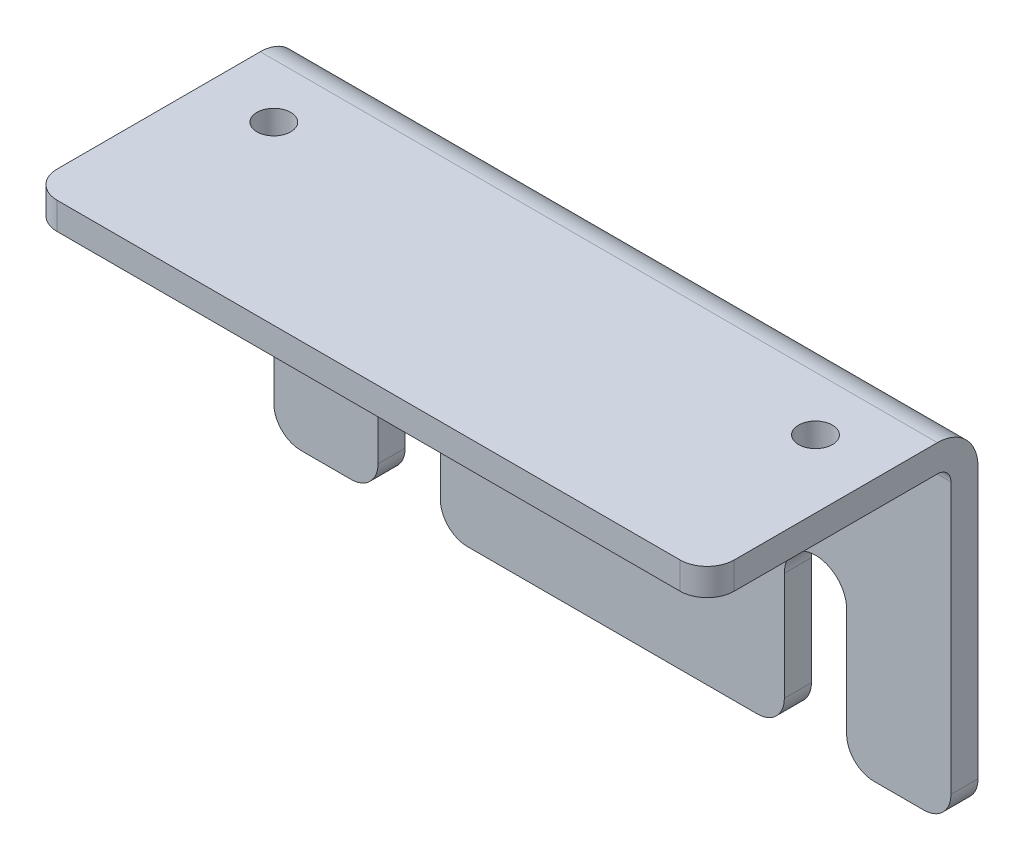
ISO-10303-21;
HEADER;
FILE_DESCRIPTION(('STEP AP214'),'2;1');
FILE_NAME('part.step','',(''),(''),'','','');
FILE_SCHEMA(('AUTOMOTIVE_DESIGN { 1 0 10303 214 1 1 1 1 }'));
ENDSEC;
DATA;
#1=APPLICATION_CONTEXT('core data for automotive mechanical design processes');
#2=APPLICATION_PROTOCOL_DEFINITION('international standard','automotive_design',2000,#1);
#3=PRODUCT_CONTEXT('',#1,'mechanical');
#4=PRODUCT('Part','Part','',(#3));
#5=PRODUCT_RELATED_PRODUCT_CATEGORY('part','',(#4));
#6=PRODUCT_DEFINITION_FORMATION('','',#4);
#7=PRODUCT_DEFINITION_CONTEXT('part definition',#1,'design');
#8=PRODUCT_DEFINITION('design','',#6,#7);
#9=PRODUCT_DEFINITION_SHAPE('','',#8);
#10=(LENGTH_UNIT() NAMED_UNIT(*) SI_UNIT(.MILLI.,.METRE.));
#11=(NAMED_UNIT(*) PLANE_ANGLE_UNIT() SI_UNIT($,.RADIAN.));
#12=(NAMED_UNIT(*) SI_UNIT($,.STERADIAN.) SOLID_ANGLE_UNIT());
#13=UNCERTAINTY_MEASURE_WITH_UNIT(LENGTH_MEASURE(1.E-05),#10,'distance_accuracy_value','');
#14=(GEOMETRIC_REPRESENTATION_CONTEXT(3) GLOBAL_UNCERTAINTY_ASSIGNED_CONTEXT((#13)) GLOBAL_UNIT_ASSIGNED_CONTEXT((#10,
#11,#12)) REPRESENTATION_CONTEXT('',''));
#15=CARTESIAN_POINT('',(0.,0.,0.));
#16=DIRECTION('',(0.,0.,1.));
#17=DIRECTION('',(1.,0.,0.));
#18=AXIS2_PLACEMENT_3D('',#15,#16,#17);
#19=CARTESIAN_POINT('',(-25.,-93.1219674120872,0.));
#20=DIRECTION('',(0.,0.,-1.));
#21=DIRECTION('',(0.,-1.,0.));
#22=AXIS2_PLACEMENT_3D('',#19,#20,#21);
#23=PLANE('',#22);
#24=DIRECTION('',(0.,1.,0.));
#25=VECTOR('',#24,1.);
#26=CARTESIAN_POINT('',(-23.,-93.1219674120872,0.));
#27=LINE('',#26,#25);
#28=CARTESIAN_POINT('',(-23.,10.5,0.));
#29=VERTEX_POINT('',#28);
#30=CARTESIAN_POINT('',(-23.,12.5,0.));
#31=VERTEX_POINT('',#30);
#32=EDGE_CURVE('E219',#29,#31,#27,.T.);
#33=ORIENTED_EDGE('',*,*,#32,.F.);
#34=DIRECTION('',(1.,0.,0.));
#35=VECTOR('',#34,1.);
#36=CARTESIAN_POINT('',(-25.,10.5,0.));
#37=LINE('',#36,#35);
#38=CARTESIAN_POINT('',(23.,10.5,0.));
#39=VERTEX_POINT('',#38);
#40=EDGE_CURVE('E266',#29,#39,#37,.T.);
#41=ORIENTED_EDGE('',*,*,#40,.T.);
#42=DIRECTION('',(0.,1.,0.));
#43=VECTOR('',#42,1.);
#44=CARTESIAN_POINT('',(23.,-93.1219674120872,0.));
#45=LINE('',#44,#43);
#46=CARTESIAN_POINT('',(23.,12.5,0.));
#47=VERTEX_POINT('',#46);
#48=EDGE_CURVE('E251',#39,#47,#45,.T.);
#49=ORIENTED_EDGE('',*,*,#48,.T.);
#50=DIRECTION('',(1.,0.,0.));
#51=VECTOR('',#50,1.);
#52=CARTESIAN_POINT('',(-25.,12.5,0.));
#53=LINE('',#52,#51);
#54=EDGE_CURVE('E254',#31,#47,#53,.T.);
#55=ORIENTED_EDGE('',*,*,#54,.F.);
#56=EDGE_LOOP('',(#33,#41,#49,#55));
#57=FACE_BOUND('',#56,.T.);
#58=ADVANCED_FACE('F38',(#57),#23,.F.);
#59=CARTESIAN_POINT('',(23.,-93.1219674120872,-2.00000000000001));
#60=DIRECTION('',(0.,1.,0.));
#61=DIRECTION('',(0.,0.,-1.));
#62=AXIS2_PLACEMENT_3D('',#59,#60,#61);
#63=CYLINDRICAL_SURFACE('',#62,2.);
#64=ORIENTED_EDGE('',*,*,#48,.F.);
#65=CARTESIAN_POINT('',(23.,10.5,-2.00000000000001));
#66=DIRECTION('',(0.,1.,0.));
#67=DIRECTION('',(0.,0.,1.));
#68=AXIS2_PLACEMENT_3D('',#65,#66,#67);
#69=CIRCLE('',#68,2.);
#70=CARTESIAN_POINT('',(25.,10.5,-2.00000000000001));
#71=VERTEX_POINT('',#70);
#72=EDGE_CURVE('E272',#39,#71,#69,.T.);
#73=ORIENTED_EDGE('',*,*,#72,.T.);
#74=DIRECTION('',(0.,1.,0.));
#75=VECTOR('',#74,1.);
#76=CARTESIAN_POINT('',(25.,-93.1219674120872,-2.00000000000001));
#77=LINE('',#76,#75);
#78=CARTESIAN_POINT('',(25.,12.5,-2.00000000000001));
#79=VERTEX_POINT('',#78);
#80=EDGE_CURVE('E237',#71,#79,#77,.T.);
#81=ORIENTED_EDGE('',*,*,#80,.T.);
#82=CARTESIAN_POINT('',(23.,12.5,-2.00000000000001));
#83=DIRECTION('',(0.,1.,0.));
#84=DIRECTION('',(0.,0.,1.));
#85=AXIS2_PLACEMENT_3D('',#82,#83,#84);
#86=CIRCLE('',#85,2.);
#87=EDGE_CURVE('E249',#47,#79,#86,.T.);
#88=ORIENTED_EDGE('',*,*,#87,.F.);
#89=EDGE_LOOP('',(#64,#73,#81,#88));
#90=FACE_BOUND('',#89,.T.);
#91=ADVANCED_FACE('F271',(#90),#63,.T.);
#92=CARTESIAN_POINT('',(20.,12.5,-13.));
#93=DIRECTION('',(0.,1.,0.));
#94=DIRECTION('',(0.,0.,-1.));
#95=AXIS2_PLACEMENT_3D('',#92,#93,#94);
#96=CYLINDRICAL_SURFACE('',#95,1.25);
#97=CARTESIAN_POINT('',(20.,12.5,-13.));
#98=DIRECTION('',(0.,-1.,0.));
#99=DIRECTION('',(0.,0.,-1.));
#100=AXIS2_PLACEMENT_3D('',#97,#98,#99);
#101=CIRCLE('',#100,1.25);
#102=CARTESIAN_POINT('',(20.,12.5,-14.25));
#103=VERTEX_POINT('',#102);
#104=EDGE_CURVE('E246',#103,#103,#101,.T.);
#105=ORIENTED_EDGE('',*,*,#104,.F.);
#106=EDGE_LOOP('',(#105));
#107=FACE_BOUND('',#106,.T.);
#108=CARTESIAN_POINT('',(20.,10.5,-13.));
#109=DIRECTION('',(0.,-1.,0.));
#110=DIRECTION('',(0.,0.,-1.));
#111=AXIS2_PLACEMENT_3D('',#108,#109,#110);
#112=CIRCLE('',#111,1.25);
#113=CARTESIAN_POINT('',(20.,10.5,-14.25));
#114=VERTEX_POINT('',#113);
#115=EDGE_CURVE('E276',#114,#114,#112,.T.);
#116=ORIENTED_EDGE('',*,*,#115,.T.);
#117=EDGE_LOOP('',(#116));
#118=FACE_BOUND('',#117,.T.);
#119=ADVANCED_FACE('F461',(#107,#118),#96,.F.);
#120=CARTESIAN_POINT('',(-20.,12.5,-13.));
#121=DIRECTION('',(0.,1.,0.));
#122=DIRECTION('',(0.,0.,-1.));
#123=AXIS2_PLACEMENT_3D('',#120,#121,#122);
#124=CYLINDRICAL_SURFACE('',#123,1.25);
#125=CARTESIAN_POINT('',(-20.,12.5,-13.));
#126=DIRECTION('',(0.,-1.,0.));
#127=DIRECTION('',(0.,0.,-1.));
#128=AXIS2_PLACEMENT_3D('',#125,#126,#127);
#129=CIRCLE('',#128,1.25);
#130=CARTESIAN_POINT('',(-20.,12.5,-14.25));
#131=VERTEX_POINT('',#130);
#132=EDGE_CURVE('E243',#131,#131,#129,.T.);
#133=ORIENTED_EDGE('',*,*,#132,.F.);
#134=EDGE_LOOP('',(#133));
#135=FACE_BOUND('',#134,.T.);
#136=CARTESIAN_POINT('',(-20.,10.5,-13.));
#137=DIRECTION('',(0.,-1.,0.));
#138=DIRECTION('',(0.,0.,-1.));
#139=AXIS2_PLACEMENT_3D('',#136,#137,#138);
#140=CIRCLE('',#139,1.25);
#141=CARTESIAN_POINT('',(-20.,10.5,-14.25));
#142=VERTEX_POINT('',#141);
#143=EDGE_CURVE('E274',#142,#142,#140,.T.);
#144=ORIENTED_EDGE('',*,*,#143,.T.);
#145=EDGE_LOOP('',(#144));
#146=FACE_BOUND('',#145,.T.);
#147=ADVANCED_FACE('F468',(#135,#146),#124,.F.);
#148=CARTESIAN_POINT('',(-23.,-93.1219674120872,-2.00000000000001));
#149=DIRECTION('',(0.,1.,0.));
#150=DIRECTION('',(0.,0.,-1.));
#151=AXIS2_PLACEMENT_3D('',#148,#149,#150);
#152=CYLINDRICAL_SURFACE('',#151,2.);
#153=DIRECTION('',(0.,1.,0.));
#154=VECTOR('',#153,1.);
#155=CARTESIAN_POINT('',(-25.,-93.1219674120872,-2.00000000000001));
#156=LINE('',#155,#154);
#157=CARTESIAN_POINT('',(-25.,10.5,-2.00000000000001));
#158=VERTEX_POINT('',#157);
#159=CARTESIAN_POINT('',(-25.,12.5,-2.00000000000001));
#160=VERTEX_POINT('',#159);
#161=EDGE_CURVE('E234',#158,#160,#156,.T.);
#162=ORIENTED_EDGE('',*,*,#161,.F.);
#163=CARTESIAN_POINT('',(-23.,10.5,-2.00000000000001));
#164=DIRECTION('',(0.,-1.,0.));
#165=DIRECTION('',(0.,0.,-1.));
#166=AXIS2_PLACEMENT_3D('',#163,#164,#165);
#167=CIRCLE('',#166,2.);
#168=EDGE_CURVE('E261',#158,#29,#167,.F.);
#169=ORIENTED_EDGE('',*,*,#168,.T.);
#170=ORIENTED_EDGE('',*,*,#32,.T.);
#171=CARTESIAN_POINT('',(-23.,12.5,-2.00000000000001));
#172=DIRECTION('',(0.,-1.,0.));
#173=DIRECTION('',(0.,0.,-1.));
#174=AXIS2_PLACEMENT_3D('',#171,#172,#173);
#175=CIRCLE('',#174,2.);
#176=EDGE_CURVE('E235',#160,#31,#175,.F.);
#177=ORIENTED_EDGE('',*,*,#176,.F.);
#178=EDGE_LOOP('',(#162,#169,#170,#177));
#179=FACE_BOUND('',#178,.T.);
#180=ADVANCED_FACE('F259',(#179),#152,.T.);
#181=CARTESIAN_POINT('',(-25.,-93.1219674120872,-20.));
#182=DIRECTION('',(1.,0.,0.));
#183=DIRECTION('',(0.,-1.,0.));
#184=AXIS2_PLACEMENT_3D('',#181,#182,#183);
#185=PLANE('',#184);
#186=DIRECTION('',(0.,0.,1.));
#187=VECTOR('',#186,1.);
#188=CARTESIAN_POINT('',(-25.,10.5,-20.));
#189=LINE('',#188,#187);
#190=CARTESIAN_POINT('',(-25.,10.5,-17.));
#191=VERTEX_POINT('',#190);
#192=EDGE_CURVE('E281',#191,#158,#189,.T.);
#193=ORIENTED_EDGE('',*,*,#192,.T.);
#194=ORIENTED_EDGE('',*,*,#161,.T.);
#195=DIRECTION('',(0.,0.,1.));
#196=VECTOR('',#195,1.);
#197=CARTESIAN_POINT('',(-25.,12.5,-20.));
#198=LINE('',#197,#196);
#199=CARTESIAN_POINT('',(-25.,12.5,-17.));
#200=VERTEX_POINT('',#199);
#201=EDGE_CURVE('E213',#160,#200,#198,.F.);
#202=ORIENTED_EDGE('',*,*,#201,.T.);
#203=CARTESIAN_POINT('',(-25.,9.5,-17.));
#204=DIRECTION('',(-1.,0.,0.));
#205=DIRECTION('',(0.,0.,1.));
#206=AXIS2_PLACEMENT_3D('',#203,#204,#205);
#207=CIRCLE('',#206,2.99999999999998);
#208=CARTESIAN_POINT('',(-25.,9.5,-20.));
#209=VERTEX_POINT('',#208);
#210=EDGE_CURVE('E222',#200,#209,#207,.T.);
#211=ORIENTED_EDGE('',*,*,#210,.T.);
#212=DIRECTION('',(0.,1.,0.));
#213=VECTOR('',#212,1.);
#214=CARTESIAN_POINT('',(-25.,0.,-20.));
#215=LINE('',#214,#213);
#216=CARTESIAN_POINT('',(-25.,-10.5,-20.));
#217=VERTEX_POINT('',#216);
#218=EDGE_CURVE('E416',#217,#209,#215,.T.);
#219=ORIENTED_EDGE('',*,*,#218,.F.);
#220=DIRECTION('',(0.,0.,-1.));
#221=VECTOR('',#220,1.);
#222=CARTESIAN_POINT('',(-25.,-10.5,89.2520022699813));
#223=LINE('',#222,#221);
#224=CARTESIAN_POINT('',(-25.,-10.5,-18.));
#225=VERTEX_POINT('',#224);
#226=EDGE_CURVE('E329',#225,#217,#223,.T.);
#227=ORIENTED_EDGE('',*,*,#226,.F.);
#228=DIRECTION('',(0.,1.,0.));
#229=VECTOR('',#228,1.);
#230=CARTESIAN_POINT('',(-25.,-12.5,-18.));
#231=LINE('',#230,#229);
#232=CARTESIAN_POINT('',(-25.,9.5,-18.));
#233=VERTEX_POINT('',#232);
#234=EDGE_CURVE('E381',#225,#233,#231,.T.);
#235=ORIENTED_EDGE('',*,*,#234,.T.);
#236=CARTESIAN_POINT('',(-25.,9.5,-17.));
#237=DIRECTION('',(-1.,0.,0.));
#238=DIRECTION('',(0.,0.,1.));
#239=AXIS2_PLACEMENT_3D('',#236,#237,#238);
#240=CIRCLE('',#239,1.);
#241=EDGE_CURVE('E430',#191,#233,#240,.T.);
#242=ORIENTED_EDGE('',*,*,#241,.F.);
#243=EDGE_LOOP('',(#193,#194,#202,#211,#219,#227,#235,#242));
#244=FACE_BOUND('',#243,.T.);
#245=ADVANCED_FACE('F232',(#244),#185,.F.);
#246=CARTESIAN_POINT('',(-25.,12.5,-20.));
#247=DIRECTION('',(0.,-1.,0.));
#248=DIRECTION('',(0.,0.,1.));
#249=AXIS2_PLACEMENT_3D('',#246,#247,#248);
#250=PLANE('',#249);
#251=ORIENTED_EDGE('',*,*,#132,.T.);
#252=EDGE_LOOP('',(#251));
#253=FACE_BOUND('',#252,.T.);
#254=ORIENTED_EDGE('',*,*,#104,.T.);
#255=EDGE_LOOP('',(#254));
#256=FACE_BOUND('',#255,.T.);
#257=ORIENTED_EDGE('',*,*,#201,.F.);
#258=ORIENTED_EDGE('',*,*,#176,.T.);
#259=ORIENTED_EDGE('',*,*,#54,.T.);
#260=ORIENTED_EDGE('',*,*,#87,.T.);
#261=DIRECTION('',(0.,0.,-1.));
#262=VECTOR('',#261,1.);
#263=CARTESIAN_POINT('',(25.,12.5,-20.));
#264=LINE('',#263,#262);
#265=CARTESIAN_POINT('',(25.,12.5,-17.));
#266=VERTEX_POINT('',#265);
#267=EDGE_CURVE('E216',#266,#79,#264,.F.);
#268=ORIENTED_EDGE('',*,*,#267,.F.);
#269=DIRECTION('',(-1.,0.,0.));
#270=VECTOR('',#269,1.);
#271=CARTESIAN_POINT('',(0.,12.5,-17.));
#272=LINE('',#271,#270);
#273=EDGE_CURVE('E42',#266,#200,#272,.T.);
#274=ORIENTED_EDGE('',*,*,#273,.T.);
#275=EDGE_LOOP('',(#257,#258,#259,#260,#268,#274));
#276=FACE_BOUND('',#275,.T.);
#277=ADVANCED_FACE('F211',(#253,#256,#276),#250,.F.);
#278=CARTESIAN_POINT('',(25.,-93.1219674120872,-20.));
#279=DIRECTION('',(-1.,0.,0.));
#280=DIRECTION('',(0.,1.,0.));
#281=AXIS2_PLACEMENT_3D('',#278,#279,#280);
#282=PLANE('',#281);
#283=ORIENTED_EDGE('',*,*,#80,.F.);
#284=DIRECTION('',(0.,0.,-1.));
#285=VECTOR('',#284,1.);
#286=CARTESIAN_POINT('',(25.,10.5,-20.));
#287=LINE('',#286,#285);
#288=CARTESIAN_POINT('',(25.,10.5,-17.));
#289=VERTEX_POINT('',#288);
#290=EDGE_CURVE('E48',#71,#289,#287,.T.);
#291=ORIENTED_EDGE('',*,*,#290,.T.);
#292=CARTESIAN_POINT('',(25.,9.5,-17.));
#293=DIRECTION('',(-1.,0.,0.));
#294=DIRECTION('',(0.,0.,1.));
#295=AXIS2_PLACEMENT_3D('',#292,#293,#294);
#296=CIRCLE('',#295,1.);
#297=CARTESIAN_POINT('',(25.,9.5,-18.));
#298=VERTEX_POINT('',#297);
#299=EDGE_CURVE('E229',#298,#289,#296,.F.);
#300=ORIENTED_EDGE('',*,*,#299,.F.);
#301=DIRECTION('',(0.,1.,0.));
#302=VECTOR('',#301,1.);
#303=CARTESIAN_POINT('',(25.,-12.5,-18.));
#304=LINE('',#303,#302);
#305=CARTESIAN_POINT('',(25.,-10.5,-18.));
#306=VERTEX_POINT('',#305);
#307=EDGE_CURVE('E376',#298,#306,#304,.F.);
#308=ORIENTED_EDGE('',*,*,#307,.T.);
#309=DIRECTION('',(0.,0.,-1.));
#310=VECTOR('',#309,1.);
#311=CARTESIAN_POINT('',(25.,-10.5,89.2520022699813));
#312=LINE('',#311,#310);
#313=CARTESIAN_POINT('',(25.,-10.5,-20.));
#314=VERTEX_POINT('',#313);
#315=EDGE_CURVE('E220',#306,#314,#312,.T.);
#316=ORIENTED_EDGE('',*,*,#315,.T.);
#317=DIRECTION('',(0.,1.,0.));
#318=VECTOR('',#317,1.);
#319=CARTESIAN_POINT('',(25.,0.,-20.));
#320=LINE('',#319,#318);
#321=CARTESIAN_POINT('',(25.,9.5,-20.));
#322=VERTEX_POINT('',#321);
#323=EDGE_CURVE('E419',#322,#314,#320,.F.);
#324=ORIENTED_EDGE('',*,*,#323,.F.);
#325=CARTESIAN_POINT('',(25.,9.5,-17.));
#326=DIRECTION('',(-1.,0.,0.));
#327=DIRECTION('',(0.,0.,1.));
#328=AXIS2_PLACEMENT_3D('',#325,#326,#327);
#329=CIRCLE('',#328,2.99999999999998);
#330=EDGE_CURVE('E228',#322,#266,#329,.F.);
#331=ORIENTED_EDGE('',*,*,#330,.T.);
#332=ORIENTED_EDGE('',*,*,#267,.T.);
#333=EDGE_LOOP('',(#283,#291,#300,#308,#316,#324,#331,#332));
#334=FACE_BOUND('',#333,.T.);
#335=ADVANCED_FACE('F433',(#334),#282,.F.);
#336=CARTESIAN_POINT('',(-25.,10.5,-20.));
#337=DIRECTION('',(0.,-1.,0.));
#338=DIRECTION('',(0.,0.,1.));
#339=AXIS2_PLACEMENT_3D('',#336,#337,#338);
#340=PLANE('',#339);
#341=ORIENTED_EDGE('',*,*,#143,.F.);
#342=EDGE_LOOP('',(#341));
#343=FACE_BOUND('',#342,.T.);
#344=ORIENTED_EDGE('',*,*,#115,.F.);
#345=EDGE_LOOP('',(#344));
#346=FACE_BOUND('',#345,.T.);
#347=ORIENTED_EDGE('',*,*,#192,.F.);
#348=DIRECTION('',(1.,0.,0.));
#349=VECTOR('',#348,1.);
#350=CARTESIAN_POINT('',(-25.,10.5,-17.));
#351=LINE('',#350,#349);
#352=EDGE_CURVE('E11',#289,#191,#351,.F.);
#353=ORIENTED_EDGE('',*,*,#352,.F.);
#354=ORIENTED_EDGE('',*,*,#290,.F.);
#355=ORIENTED_EDGE('',*,*,#72,.F.);
#356=ORIENTED_EDGE('',*,*,#40,.F.);
#357=ORIENTED_EDGE('',*,*,#168,.F.);
#358=EDGE_LOOP('',(#347,#353,#354,#355,#356,#357));
#359=FACE_BOUND('',#358,.T.);
#360=ADVANCED_FACE('F40',(#343,#346,#359),#340,.T.);
#361=CARTESIAN_POINT('',(0.,0.,-18.));
#362=DIRECTION('',(0.,0.,1.));
#363=DIRECTION('',(-1.,0.,0.));
#364=AXIS2_PLACEMENT_3D('',#361,#362,#363);
#365=PLANE('',#364);
#366=ORIENTED_EDGE('',*,*,#234,.F.);
#367=CARTESIAN_POINT('',(-23.,-10.5,-18.));
#368=DIRECTION('',(0.,0.,-1.));
#369=DIRECTION('',(-1.,0.,0.));
#370=AXIS2_PLACEMENT_3D('',#367,#368,#369);
#371=CIRCLE('',#370,2.);
#372=CARTESIAN_POINT('',(-23.,-12.5,-18.));
#373=VERTEX_POINT('',#372);
#374=EDGE_CURVE('E332',#225,#373,#371,.F.);
#375=ORIENTED_EDGE('',*,*,#374,.T.);
#376=DIRECTION('',(1.,0.,0.));
#377=VECTOR('',#376,1.);
#378=CARTESIAN_POINT('',(-25.,-12.5,-18.));
#379=LINE('',#378,#377);
#380=CARTESIAN_POINT('',(-19.3,-12.5,-18.));
#381=VERTEX_POINT('',#380);
#382=EDGE_CURVE('E335',#381,#373,#379,.F.);
#383=ORIENTED_EDGE('',*,*,#382,.F.);
#384=CARTESIAN_POINT('',(-19.3,-10.5,-18.));
#385=DIRECTION('',(0.,0.,1.));
#386=DIRECTION('',(1.,0.,0.));
#387=AXIS2_PLACEMENT_3D('',#384,#385,#386);
#388=CIRCLE('',#387,2.);
#389=CARTESIAN_POINT('',(-17.3,-10.5,-18.));
#390=VERTEX_POINT('',#389);
#391=EDGE_CURVE('E338',#381,#390,#388,.T.);
#392=ORIENTED_EDGE('',*,*,#391,.T.);
#393=DIRECTION('',(0.,1.,0.));
#394=VECTOR('',#393,1.);
#395=CARTESIAN_POINT('',(-17.3,-22.5,-18.));
#396=LINE('',#395,#394);
#397=CARTESIAN_POINT('',(-17.3,-2.50000000000001,-18.));
#398=VERTEX_POINT('',#397);
#399=EDGE_CURVE('E341',#398,#390,#396,.F.);
#400=ORIENTED_EDGE('',*,*,#399,.F.);
#401=CARTESIAN_POINT('',(-15.,-2.50000000000001,-18.));
#402=DIRECTION('',(0.,0.,1.));
#403=DIRECTION('',(1.,0.,0.));
#404=AXIS2_PLACEMENT_3D('',#401,#402,#403);
#405=CIRCLE('',#404,2.29999999999999);
#406=CARTESIAN_POINT('',(-12.7,-2.50000000000001,-18.));
#407=VERTEX_POINT('',#406);
#408=EDGE_CURVE('E344',#407,#398,#405,.T.);
#409=ORIENTED_EDGE('',*,*,#408,.F.);
#410=DIRECTION('',(0.,1.,0.));
#411=VECTOR('',#410,1.);
#412=CARTESIAN_POINT('',(-12.7,-22.5,-18.));
#413=LINE('',#412,#411);
#414=CARTESIAN_POINT('',(-12.7,-10.5,-18.));
#415=VERTEX_POINT('',#414);
#416=EDGE_CURVE('E347',#415,#407,#413,.T.);
#417=ORIENTED_EDGE('',*,*,#416,.F.);
#418=CARTESIAN_POINT('',(-10.7,-10.5,-18.));
#419=DIRECTION('',(0.,0.,-1.));
#420=DIRECTION('',(-1.,0.,0.));
#421=AXIS2_PLACEMENT_3D('',#418,#419,#420);
#422=CIRCLE('',#421,2.);
#423=CARTESIAN_POINT('',(-10.7,-12.5,-18.));
#424=VERTEX_POINT('',#423);
#425=EDGE_CURVE('E350',#415,#424,#422,.F.);
#426=ORIENTED_EDGE('',*,*,#425,.T.);
#427=DIRECTION('',(1.,0.,0.));
#428=VECTOR('',#427,1.);
#429=CARTESIAN_POINT('',(-25.,-12.5,-18.));
#430=LINE('',#429,#428);
#431=CARTESIAN_POINT('',(10.7,-12.5,-18.));
#432=VERTEX_POINT('',#431);
#433=EDGE_CURVE('E353',#432,#424,#430,.F.);
#434=ORIENTED_EDGE('',*,*,#433,.F.);
#435=CARTESIAN_POINT('',(10.7,-10.5,-18.));
#436=DIRECTION('',(0.,0.,1.));
#437=DIRECTION('',(1.,0.,0.));
#438=AXIS2_PLACEMENT_3D('',#435,#436,#437);
#439=CIRCLE('',#438,2.);
#440=CARTESIAN_POINT('',(12.7,-10.5,-18.));
#441=VERTEX_POINT('',#440);
#442=EDGE_CURVE('E356',#432,#441,#439,.T.);
#443=ORIENTED_EDGE('',*,*,#442,.T.);
#444=DIRECTION('',(0.,-1.,0.));
#445=VECTOR('',#444,1.);
#446=CARTESIAN_POINT('',(12.7,-22.5,-18.));
#447=LINE('',#446,#445);
#448=CARTESIAN_POINT('',(12.7,-2.5,-18.));
#449=VERTEX_POINT('',#448);
#450=EDGE_CURVE('E359',#449,#441,#447,.T.);
#451=ORIENTED_EDGE('',*,*,#450,.F.);
#452=CARTESIAN_POINT('',(15.,-2.5,-18.));
#453=DIRECTION('',(0.,0.,1.));
#454=DIRECTION('',(1.,0.,0.));
#455=AXIS2_PLACEMENT_3D('',#452,#453,#454);
#456=CIRCLE('',#455,2.3);
#457=CARTESIAN_POINT('',(17.3,-2.5,-18.));
#458=VERTEX_POINT('',#457);
#459=EDGE_CURVE('E362',#458,#449,#456,.T.);
#460=ORIENTED_EDGE('',*,*,#459,.F.);
#461=DIRECTION('',(0.,1.,0.));
#462=VECTOR('',#461,1.);
#463=CARTESIAN_POINT('',(17.3,-22.5,-18.));
#464=LINE('',#463,#462);
#465=CARTESIAN_POINT('',(17.3,-10.5,-18.));
#466=VERTEX_POINT('',#465);
#467=EDGE_CURVE('E365',#466,#458,#464,.T.);
#468=ORIENTED_EDGE('',*,*,#467,.F.);
#469=CARTESIAN_POINT('',(19.3,-10.5,-18.));
#470=DIRECTION('',(0.,0.,-1.));
#471=DIRECTION('',(-1.,0.,0.));
#472=AXIS2_PLACEMENT_3D('',#469,#470,#471);
#473=CIRCLE('',#472,2.);
#474=CARTESIAN_POINT('',(19.3,-12.5,-18.));
#475=VERTEX_POINT('',#474);
#476=EDGE_CURVE('E368',#466,#475,#473,.F.);
#477=ORIENTED_EDGE('',*,*,#476,.T.);
#478=DIRECTION('',(1.,0.,0.));
#479=VECTOR('',#478,1.);
#480=CARTESIAN_POINT('',(-25.,-12.5,-18.));
#481=LINE('',#480,#479);
#482=CARTESIAN_POINT('',(23.,-12.5,-18.));
#483=VERTEX_POINT('',#482);
#484=EDGE_CURVE('E371',#483,#475,#481,.F.);
#485=ORIENTED_EDGE('',*,*,#484,.F.);
#486=CARTESIAN_POINT('',(23.,-10.5,-18.));
#487=DIRECTION('',(0.,0.,-1.));
#488=DIRECTION('',(-1.,0.,0.));
#489=AXIS2_PLACEMENT_3D('',#486,#487,#488);
#490=CIRCLE('',#489,2.);
#491=EDGE_CURVE('E374',#483,#306,#490,.F.);
#492=ORIENTED_EDGE('',*,*,#491,.T.);
#493=ORIENTED_EDGE('',*,*,#307,.F.);
#494=DIRECTION('',(-1.,0.,0.));
#495=VECTOR('',#494,1.);
#496=CARTESIAN_POINT('',(0.,9.5,-18.));
#497=LINE('',#496,#495);
#498=EDGE_CURVE('E379',#233,#298,#497,.F.);
#499=ORIENTED_EDGE('',*,*,#498,.F.);
#500=EDGE_LOOP('',(#366,#375,#383,#392,#400,#409,#417,#426,#434,#443,#451,#460,#468,#477,#485,
#492,#493,#499));
#501=FACE_BOUND('',#500,.T.);
#502=ADVANCED_FACE('F442',(#501),#365,.T.);
#503=CARTESIAN_POINT('',(23.,-10.5,89.2520022699813));
#504=DIRECTION('',(0.,0.,-1.));
#505=DIRECTION('',(1.,0.,0.));
#506=AXIS2_PLACEMENT_3D('',#503,#504,#505);
#507=CYLINDRICAL_SURFACE('',#506,2.);
#508=CARTESIAN_POINT('',(23.,-10.5,-20.));
#509=DIRECTION('',(0.,0.,-1.));
#510=DIRECTION('',(-1.,0.,0.));
#511=AXIS2_PLACEMENT_3D('',#508,#509,#510);
#512=CIRCLE('',#511,2.);
#513=CARTESIAN_POINT('',(23.,-12.5,-20.));
#514=VERTEX_POINT('',#513);
#515=EDGE_CURVE('E95',#314,#514,#512,.T.);
#516=ORIENTED_EDGE('',*,*,#515,.F.);
#517=ORIENTED_EDGE('',*,*,#315,.F.);
#518=ORIENTED_EDGE('',*,*,#491,.F.);
#519=DIRECTION('',(0.,0.,-1.));
#520=VECTOR('',#519,1.);
#521=CARTESIAN_POINT('',(23.,-12.5,89.2520022699813));
#522=LINE('',#521,#520);
#523=EDGE_CURVE('E289',#483,#514,#522,.T.);
#524=ORIENTED_EDGE('',*,*,#523,.T.);
#525=EDGE_LOOP('',(#516,#517,#518,#524));
#526=FACE_BOUND('',#525,.T.);
#527=ADVANCED_FACE('F452',(#526),#507,.T.);
#528=CARTESIAN_POINT('',(-25.,-12.5,89.2520022699813));
#529=DIRECTION('',(0.,1.,0.));
#530=DIRECTION('',(0.,0.,-1.));
#531=AXIS2_PLACEMENT_3D('',#528,#529,#530);
#532=PLANE('',#531);
#533=ORIENTED_EDGE('',*,*,#523,.F.);
#534=ORIENTED_EDGE('',*,*,#484,.T.);
#535=DIRECTION('',(0.,0.,-1.));
#536=VECTOR('',#535,1.);
#537=CARTESIAN_POINT('',(19.3,-12.5,89.2520022699813));
#538=LINE('',#537,#536);
#539=CARTESIAN_POINT('',(19.3,-12.5,-20.));
#540=VERTEX_POINT('',#539);
#541=EDGE_CURVE('E291',#475,#540,#538,.T.);
#542=ORIENTED_EDGE('',*,*,#541,.T.);
#543=DIRECTION('',(-1.,0.,0.));
#544=VECTOR('',#543,1.);
#545=CARTESIAN_POINT('',(0.,-12.5,-20.));
#546=LINE('',#545,#544);
#547=EDGE_CURVE('E103',#514,#540,#546,.T.);
#548=ORIENTED_EDGE('',*,*,#547,.F.);
#549=EDGE_LOOP('',(#533,#534,#542,#548));
#550=FACE_BOUND('',#549,.T.);
#551=ADVANCED_FACE('F514',(#550),#532,.F.);
#552=CARTESIAN_POINT('',(19.3,-10.5,89.2520022699813));
#553=DIRECTION('',(0.,0.,-1.));
#554=DIRECTION('',(1.,0.,0.));
#555=AXIS2_PLACEMENT_3D('',#552,#553,#554);
#556=CYLINDRICAL_SURFACE('',#555,2.);
#557=CARTESIAN_POINT('',(19.3,-10.5,-20.));
#558=DIRECTION('',(0.,0.,-1.));
#559=DIRECTION('',(-1.,0.,0.));
#560=AXIS2_PLACEMENT_3D('',#557,#558,#559);
#561=CIRCLE('',#560,2.);
#562=CARTESIAN_POINT('',(17.3,-10.5,-20.));
#563=VERTEX_POINT('',#562);
#564=EDGE_CURVE('E423',#540,#563,#561,.T.);
#565=ORIENTED_EDGE('',*,*,#564,.F.);
#566=ORIENTED_EDGE('',*,*,#541,.F.);
#567=ORIENTED_EDGE('',*,*,#476,.F.);
#568=DIRECTION('',(0.,0.,-1.));
#569=VECTOR('',#568,1.);
#570=CARTESIAN_POINT('',(17.3,-10.5,89.2520022699813));
#571=LINE('',#570,#569);
#572=EDGE_CURVE('E293',#466,#563,#571,.T.);
#573=ORIENTED_EDGE('',*,*,#572,.T.);
#574=EDGE_LOOP('',(#565,#566,#567,#573));
#575=FACE_BOUND('',#574,.T.);
#576=ADVANCED_FACE('F522',(#575),#556,.T.);
#577=CARTESIAN_POINT('',(17.3,-22.5,89.2520022699813));
#578=DIRECTION('',(1.,0.,0.));
#579=DIRECTION('',(0.,0.,1.));
#580=AXIS2_PLACEMENT_3D('',#577,#578,#579);
#581=PLANE('',#580);
#582=ORIENTED_EDGE('',*,*,#572,.F.);
#583=ORIENTED_EDGE('',*,*,#467,.T.);
#584=DIRECTION('',(0.,0.,-1.));
#585=VECTOR('',#584,1.);
#586=CARTESIAN_POINT('',(17.3,-2.5,89.2520022699813));
#587=LINE('',#586,#585);
#588=CARTESIAN_POINT('',(17.3,-2.5,-20.));
#589=VERTEX_POINT('',#588);
#590=EDGE_CURVE('E296',#458,#589,#587,.T.);
#591=ORIENTED_EDGE('',*,*,#590,.T.);
#592=DIRECTION('',(0.,1.,0.));
#593=VECTOR('',#592,1.);
#594=CARTESIAN_POINT('',(17.3,0.,-20.));
#595=LINE('',#594,#593);
#596=EDGE_CURVE('E426',#563,#589,#595,.T.);
#597=ORIENTED_EDGE('',*,*,#596,.F.);
#598=EDGE_LOOP('',(#582,#583,#591,#597));
#599=FACE_BOUND('',#598,.T.);
#600=ADVANCED_FACE('F530',(#599),#581,.F.);
#601=CARTESIAN_POINT('',(15.,-2.5,89.2520022699813));
#602=DIRECTION('',(0.,0.,-1.));
#603=DIRECTION('',(1.,0.,0.));
#604=AXIS2_PLACEMENT_3D('',#601,#602,#603);
#605=CYLINDRICAL_SURFACE('',#604,2.3);
#606=ORIENTED_EDGE('',*,*,#590,.F.);
#607=ORIENTED_EDGE('',*,*,#459,.T.);
#608=DIRECTION('',(0.,0.,-1.));
#609=VECTOR('',#608,1.);
#610=CARTESIAN_POINT('',(12.7,-2.5,89.2520022699813));
#611=LINE('',#610,#609);
#612=CARTESIAN_POINT('',(12.7,-2.5,-20.));
#613=VERTEX_POINT('',#612);
#614=EDGE_CURVE('E299',#449,#613,#611,.T.);
#615=ORIENTED_EDGE('',*,*,#614,.T.);
#616=CARTESIAN_POINT('',(15.,-2.5,-20.));
#617=DIRECTION('',(0.,0.,1.));
#618=DIRECTION('',(1.,0.,0.));
#619=AXIS2_PLACEMENT_3D('',#616,#617,#618);
#620=CIRCLE('',#619,2.3);
#621=EDGE_CURVE('E384',#589,#613,#620,.T.);
#622=ORIENTED_EDGE('',*,*,#621,.F.);
#623=EDGE_LOOP('',(#606,#607,#615,#622));
#624=FACE_BOUND('',#623,.T.);
#625=ADVANCED_FACE('F540',(#624),#605,.F.);
#626=CARTESIAN_POINT('',(12.7,-22.5,89.2520022699813));
#627=DIRECTION('',(-1.,0.,0.));
#628=DIRECTION('',(0.,-1.,0.));
#629=AXIS2_PLACEMENT_3D('',#626,#627,#628);
#630=PLANE('',#629);
#631=ORIENTED_EDGE('',*,*,#614,.F.);
#632=ORIENTED_EDGE('',*,*,#450,.T.);
#633=DIRECTION('',(0.,0.,-1.));
#634=VECTOR('',#633,1.);
#635=CARTESIAN_POINT('',(12.7,-10.5,89.2520022699813));
#636=LINE('',#635,#634);
#637=CARTESIAN_POINT('',(12.7,-10.5,-20.));
#638=VERTEX_POINT('',#637);
#639=EDGE_CURVE('E302',#441,#638,#636,.T.);
#640=ORIENTED_EDGE('',*,*,#639,.T.);
#641=DIRECTION('',(0.,1.,0.));
#642=VECTOR('',#641,1.);
#643=CARTESIAN_POINT('',(12.7,0.,-20.));
#644=LINE('',#643,#642);
#645=EDGE_CURVE('E387',#613,#638,#644,.F.);
#646=ORIENTED_EDGE('',*,*,#645,.F.);
#647=EDGE_LOOP('',(#631,#632,#640,#646));
#648=FACE_BOUND('',#647,.T.);
#649=ADVANCED_FACE('F550',(#648),#630,.F.);
#650=CARTESIAN_POINT('',(10.7,-10.5,89.2520022699813));
#651=DIRECTION('',(0.,0.,-1.));
#652=DIRECTION('',(1.,0.,0.));
#653=AXIS2_PLACEMENT_3D('',#650,#651,#652);
#654=CYLINDRICAL_SURFACE('',#653,2.);
#655=CARTESIAN_POINT('',(10.7,-10.5,-20.));
#656=DIRECTION('',(0.,0.,1.));
#657=DIRECTION('',(1.,0.,0.));
#658=AXIS2_PLACEMENT_3D('',#655,#656,#657);
#659=CIRCLE('',#658,2.);
#660=CARTESIAN_POINT('',(10.7,-12.5,-20.));
#661=VERTEX_POINT('',#660);
#662=EDGE_CURVE('E390',#638,#661,#659,.F.);
#663=ORIENTED_EDGE('',*,*,#662,.F.);
#664=ORIENTED_EDGE('',*,*,#639,.F.);
#665=ORIENTED_EDGE('',*,*,#442,.F.);
#666=DIRECTION('',(0.,0.,-1.));
#667=VECTOR('',#666,1.);
#668=CARTESIAN_POINT('',(10.7,-12.5,89.2520022699813));
#669=LINE('',#668,#667);
#670=EDGE_CURVE('E305',#432,#661,#669,.T.);
#671=ORIENTED_EDGE('',*,*,#670,.T.);
#672=EDGE_LOOP('',(#663,#664,#665,#671));
#673=FACE_BOUND('',#672,.T.);
#674=ADVANCED_FACE('F560',(#673),#654,.T.);
#675=CARTESIAN_POINT('',(-25.,-12.5,89.2520022699813));
#676=DIRECTION('',(0.,1.,0.));
#677=DIRECTION('',(0.,0.,-1.));
#678=AXIS2_PLACEMENT_3D('',#675,#676,#677);
#679=PLANE('',#678);
#680=ORIENTED_EDGE('',*,*,#670,.F.);
#681=ORIENTED_EDGE('',*,*,#433,.T.);
#682=DIRECTION('',(0.,0.,-1.));
#683=VECTOR('',#682,1.);
#684=CARTESIAN_POINT('',(-10.7,-12.5,89.2520022699813));
#685=LINE('',#684,#683);
#686=CARTESIAN_POINT('',(-10.7,-12.5,-20.));
#687=VERTEX_POINT('',#686);
#688=EDGE_CURVE('E308',#424,#687,#685,.T.);
#689=ORIENTED_EDGE('',*,*,#688,.T.);
#690=DIRECTION('',(-1.,0.,0.));
#691=VECTOR('',#690,1.);
#692=CARTESIAN_POINT('',(0.,-12.5,-20.));
#693=LINE('',#692,#691);
#694=EDGE_CURVE('E393',#661,#687,#693,.T.);
#695=ORIENTED_EDGE('',*,*,#694,.F.);
#696=EDGE_LOOP('',(#680,#681,#689,#695));
#697=FACE_BOUND('',#696,.T.);
#698=ADVANCED_FACE('F570',(#697),#679,.F.);
#699=CARTESIAN_POINT('',(-10.7,-10.5,89.2520022699813));
#700=DIRECTION('',(0.,0.,-1.));
#701=DIRECTION('',(1.,0.,0.));
#702=AXIS2_PLACEMENT_3D('',#699,#700,#701);
#703=CYLINDRICAL_SURFACE('',#702,2.);
#704=CARTESIAN_POINT('',(-10.7,-10.5,-20.));
#705=DIRECTION('',(0.,0.,-1.));
#706=DIRECTION('',(-1.,0.,0.));
#707=AXIS2_PLACEMENT_3D('',#704,#705,#706);
#708=CIRCLE('',#707,2.);
#709=CARTESIAN_POINT('',(-12.7,-10.5,-20.));
#710=VERTEX_POINT('',#709);
#711=EDGE_CURVE('E396',#687,#710,#708,.T.);
#712=ORIENTED_EDGE('',*,*,#711,.F.);
#713=ORIENTED_EDGE('',*,*,#688,.F.);
#714=ORIENTED_EDGE('',*,*,#425,.F.);
#715=DIRECTION('',(0.,0.,-1.));
#716=VECTOR('',#715,1.);
#717=CARTESIAN_POINT('',(-12.7,-10.5,89.2520022699813));
#718=LINE('',#717,#716);
#719=EDGE_CURVE('E311',#415,#710,#718,.T.);
#720=ORIENTED_EDGE('',*,*,#719,.T.);
#721=EDGE_LOOP('',(#712,#713,#714,#720));
#722=FACE_BOUND('',#721,.T.);
#723=ADVANCED_FACE('F580',(#722),#703,.T.);
#724=CARTESIAN_POINT('',(-12.7,-22.5,89.2520022699813));
#725=DIRECTION('',(1.,0.,0.));
#726=DIRECTION('',(0.,1.,0.));
#727=AXIS2_PLACEMENT_3D('',#724,#725,#726);
#728=PLANE('',#727);
#729=ORIENTED_EDGE('',*,*,#719,.F.);
#730=ORIENTED_EDGE('',*,*,#416,.T.);
#731=DIRECTION('',(0.,0.,-1.));
#732=VECTOR('',#731,1.);
#733=CARTESIAN_POINT('',(-12.7,-2.50000000000001,89.2520022699813));
#734=LINE('',#733,#732);
#735=CARTESIAN_POINT('',(-12.7,-2.50000000000001,-20.));
#736=VERTEX_POINT('',#735);
#737=EDGE_CURVE('E314',#407,#736,#734,.T.);
#738=ORIENTED_EDGE('',*,*,#737,.T.);
#739=DIRECTION('',(0.,1.,0.));
#740=VECTOR('',#739,1.);
#741=CARTESIAN_POINT('',(-12.7,0.,-20.));
#742=LINE('',#741,#740);
#743=EDGE_CURVE('E399',#710,#736,#742,.T.);
#744=ORIENTED_EDGE('',*,*,#743,.F.);
#745=EDGE_LOOP('',(#729,#730,#738,#744));
#746=FACE_BOUND('',#745,.T.);
#747=ADVANCED_FACE('F590',(#746),#728,.F.);
#748=CARTESIAN_POINT('',(-15.,-2.50000000000001,89.2520022699813));
#749=DIRECTION('',(0.,0.,-1.));
#750=DIRECTION('',(1.,0.,0.));
#751=AXIS2_PLACEMENT_3D('',#748,#749,#750);
#752=CYLINDRICAL_SURFACE('',#751,2.29999999999999);
#753=ORIENTED_EDGE('',*,*,#737,.F.);
#754=ORIENTED_EDGE('',*,*,#408,.T.);
#755=DIRECTION('',(0.,0.,-1.));
#756=VECTOR('',#755,1.);
#757=CARTESIAN_POINT('',(-17.3,-2.50000000000001,89.2520022699813));
#758=LINE('',#757,#756);
#759=CARTESIAN_POINT('',(-17.3,-2.50000000000001,-20.));
#760=VERTEX_POINT('',#759);
#761=EDGE_CURVE('E317',#398,#760,#758,.T.);
#762=ORIENTED_EDGE('',*,*,#761,.T.);
#763=CARTESIAN_POINT('',(-15.,-2.50000000000001,-20.));
#764=DIRECTION('',(0.,0.,1.));
#765=DIRECTION('',(1.,0.,0.));
#766=AXIS2_PLACEMENT_3D('',#763,#764,#765);
#767=CIRCLE('',#766,2.29999999999999);
#768=EDGE_CURVE('E402',#736,#760,#767,.T.);
#769=ORIENTED_EDGE('',*,*,#768,.F.);
#770=EDGE_LOOP('',(#753,#754,#762,#769));
#771=FACE_BOUND('',#770,.T.);
#772=ADVANCED_FACE('F600',(#771),#752,.F.);
#773=CARTESIAN_POINT('',(-17.3,-22.5,89.2520022699813));
#774=DIRECTION('',(-1.,0.,0.));
#775=DIRECTION('',(0.,0.,-1.));
#776=AXIS2_PLACEMENT_3D('',#773,#774,#775);
#777=PLANE('',#776);
#778=ORIENTED_EDGE('',*,*,#761,.F.);
#779=ORIENTED_EDGE('',*,*,#399,.T.);
#780=DIRECTION('',(0.,0.,-1.));
#781=VECTOR('',#780,1.);
#782=CARTESIAN_POINT('',(-17.3,-10.5,89.2520022699813));
#783=LINE('',#782,#781);
#784=CARTESIAN_POINT('',(-17.3,-10.5,-20.));
#785=VERTEX_POINT('',#784);
#786=EDGE_CURVE('E320',#390,#785,#783,.T.);
#787=ORIENTED_EDGE('',*,*,#786,.T.);
#788=DIRECTION('',(0.,1.,0.));
#789=VECTOR('',#788,1.);
#790=CARTESIAN_POINT('',(-17.3,0.,-20.));
#791=LINE('',#790,#789);
#792=EDGE_CURVE('E405',#760,#785,#791,.F.);
#793=ORIENTED_EDGE('',*,*,#792,.F.);
#794=EDGE_LOOP('',(#778,#779,#787,#793));
#795=FACE_BOUND('',#794,.T.);
#796=ADVANCED_FACE('F610',(#795),#777,.F.);
#797=CARTESIAN_POINT('',(-19.3,-10.5,89.2520022699813));
#798=DIRECTION('',(0.,0.,-1.));
#799=DIRECTION('',(1.,0.,0.));
#800=AXIS2_PLACEMENT_3D('',#797,#798,#799);
#801=CYLINDRICAL_SURFACE('',#800,2.);
#802=CARTESIAN_POINT('',(-19.3,-10.5,-20.));
#803=DIRECTION('',(0.,0.,1.));
#804=DIRECTION('',(1.,0.,0.));
#805=AXIS2_PLACEMENT_3D('',#802,#803,#804);
#806=CIRCLE('',#805,2.);
#807=CARTESIAN_POINT('',(-19.3,-12.5,-20.));
#808=VERTEX_POINT('',#807);
#809=EDGE_CURVE('E408',#785,#808,#806,.F.);
#810=ORIENTED_EDGE('',*,*,#809,.F.);
#811=ORIENTED_EDGE('',*,*,#786,.F.);
#812=ORIENTED_EDGE('',*,*,#391,.F.);
#813=DIRECTION('',(0.,0.,-1.));
#814=VECTOR('',#813,1.);
#815=CARTESIAN_POINT('',(-19.3,-12.5,89.2520022699813));
#816=LINE('',#815,#814);
#817=EDGE_CURVE('E323',#381,#808,#816,.T.);
#818=ORIENTED_EDGE('',*,*,#817,.T.);
#819=EDGE_LOOP('',(#810,#811,#812,#818));
#820=FACE_BOUND('',#819,.T.);
#821=ADVANCED_FACE('F620',(#820),#801,.T.);
#822=CARTESIAN_POINT('',(-25.,-12.5,89.2520022699813));
#823=DIRECTION('',(0.,1.,0.));
#824=DIRECTION('',(0.,0.,-1.));
#825=AXIS2_PLACEMENT_3D('',#822,#823,#824);
#826=PLANE('',#825);
#827=ORIENTED_EDGE('',*,*,#817,.F.);
#828=ORIENTED_EDGE('',*,*,#382,.T.);
#829=DIRECTION('',(0.,0.,-1.));
#830=VECTOR('',#829,1.);
#831=CARTESIAN_POINT('',(-23.,-12.5,89.2520022699813));
#832=LINE('',#831,#830);
#833=CARTESIAN_POINT('',(-23.,-12.5,-20.));
#834=VERTEX_POINT('',#833);
#835=EDGE_CURVE('E326',#373,#834,#832,.T.);
#836=ORIENTED_EDGE('',*,*,#835,.T.);
#837=DIRECTION('',(-1.,0.,0.));
#838=VECTOR('',#837,1.);
#839=CARTESIAN_POINT('',(0.,-12.5,-20.));
#840=LINE('',#839,#838);
#841=EDGE_CURVE('E411',#808,#834,#840,.T.);
#842=ORIENTED_EDGE('',*,*,#841,.F.);
#843=EDGE_LOOP('',(#827,#828,#836,#842));
#844=FACE_BOUND('',#843,.T.);
#845=ADVANCED_FACE('F630',(#844),#826,.F.);
#846=CARTESIAN_POINT('',(-23.,-10.5,89.2520022699813));
#847=DIRECTION('',(0.,0.,-1.));
#848=DIRECTION('',(1.,0.,0.));
#849=AXIS2_PLACEMENT_3D('',#846,#847,#848);
#850=CYLINDRICAL_SURFACE('',#849,2.);
#851=CARTESIAN_POINT('',(-23.,-10.5,-20.));
#852=DIRECTION('',(0.,0.,-1.));
#853=DIRECTION('',(-1.,0.,0.));
#854=AXIS2_PLACEMENT_3D('',#851,#852,#853);
#855=CIRCLE('',#854,2.);
#856=EDGE_CURVE('E414',#834,#217,#855,.T.);
#857=ORIENTED_EDGE('',*,*,#856,.F.);
#858=ORIENTED_EDGE('',*,*,#835,.F.);
#859=ORIENTED_EDGE('',*,*,#374,.F.);
#860=ORIENTED_EDGE('',*,*,#226,.T.);
#861=EDGE_LOOP('',(#857,#858,#859,#860));
#862=FACE_BOUND('',#861,.T.);
#863=ADVANCED_FACE('F439',(#862),#850,.T.);
#864=CARTESIAN_POINT('',(0.,0.,-20.));
#865=DIRECTION('',(0.,0.,1.));
#866=DIRECTION('',(-1.,0.,0.));
#867=AXIS2_PLACEMENT_3D('',#864,#865,#866);
#868=PLANE('',#867);
#869=ORIENTED_EDGE('',*,*,#596,.T.);
#870=ORIENTED_EDGE('',*,*,#621,.T.);
#871=ORIENTED_EDGE('',*,*,#645,.T.);
#872=ORIENTED_EDGE('',*,*,#662,.T.);
#873=ORIENTED_EDGE('',*,*,#694,.T.);
#874=ORIENTED_EDGE('',*,*,#711,.T.);
#875=ORIENTED_EDGE('',*,*,#743,.T.);
#876=ORIENTED_EDGE('',*,*,#768,.T.);
#877=ORIENTED_EDGE('',*,*,#792,.T.);
#878=ORIENTED_EDGE('',*,*,#809,.T.);
#879=ORIENTED_EDGE('',*,*,#841,.T.);
#880=ORIENTED_EDGE('',*,*,#856,.T.);
#881=ORIENTED_EDGE('',*,*,#218,.T.);
#882=DIRECTION('',(-1.,0.,0.));
#883=VECTOR('',#882,1.);
#884=CARTESIAN_POINT('',(0.,9.5,-20.));
#885=LINE('',#884,#883);
#886=EDGE_CURVE('E224',#209,#322,#885,.F.);
#887=ORIENTED_EDGE('',*,*,#886,.T.);
#888=ORIENTED_EDGE('',*,*,#323,.T.);
#889=ORIENTED_EDGE('',*,*,#515,.T.);
#890=ORIENTED_EDGE('',*,*,#547,.T.);
#891=ORIENTED_EDGE('',*,*,#564,.T.);
#892=EDGE_LOOP('',(#869,#870,#871,#872,#873,#874,#875,#876,#877,#878,#879,#880,#881,#887,#888,
#889,#890,#891));
#893=FACE_BOUND('',#892,.T.);
#894=ADVANCED_FACE('F435',(#893),#868,.F.);
#895=CARTESIAN_POINT('',(-90.0734969092641,9.5,-17.));
#896=DIRECTION('',(1.,0.,0.));
#897=DIRECTION('',(0.,0.,1.));
#898=AXIS2_PLACEMENT_3D('',#895,#896,#897);
#899=CYLINDRICAL_SURFACE('',#898,2.99999999999998);
#900=ORIENTED_EDGE('',*,*,#210,.F.);
#901=ORIENTED_EDGE('',*,*,#273,.F.);
#902=ORIENTED_EDGE('',*,*,#330,.F.);
#903=ORIENTED_EDGE('',*,*,#886,.F.);
#904=EDGE_LOOP('',(#900,#901,#902,#903));
#905=FACE_BOUND('',#904,.T.);
#906=ADVANCED_FACE('F223',(#905),#899,.T.);
#907=CARTESIAN_POINT('',(-90.0734969092641,9.5,-17.));
#908=DIRECTION('',(1.,0.,0.));
#909=DIRECTION('',(0.,0.,1.));
#910=AXIS2_PLACEMENT_3D('',#907,#908,#909);
#911=CYLINDRICAL_SURFACE('',#910,1.);
#912=ORIENTED_EDGE('',*,*,#241,.T.);
#913=ORIENTED_EDGE('',*,*,#498,.T.);
#914=ORIENTED_EDGE('',*,*,#299,.T.);
#915=ORIENTED_EDGE('',*,*,#352,.T.);
#916=EDGE_LOOP('',(#912,#913,#914,#915));
#917=FACE_BOUND('',#916,.T.);
#918=ADVANCED_FACE('F445',(#917),#911,.F.);
#919=CLOSED_SHELL('',(#58,#91,#119,#147,#180,#245,#277,#335,#360,#502,#527,#551,#576,#600,#625,
#649,#674,#698,#723,#747,#772,#796,#821,#845,#863,#894,#906,#918));
#920=MANIFOLD_SOLID_BREP('B2',#919);
#921=ADVANCED_BREP_SHAPE_REPRESENTATION('',(#18,#920),#14);
#922=SHAPE_DEFINITION_REPRESENTATION(#9,#921);
ENDSEC;
END-ISO-10303-21;
